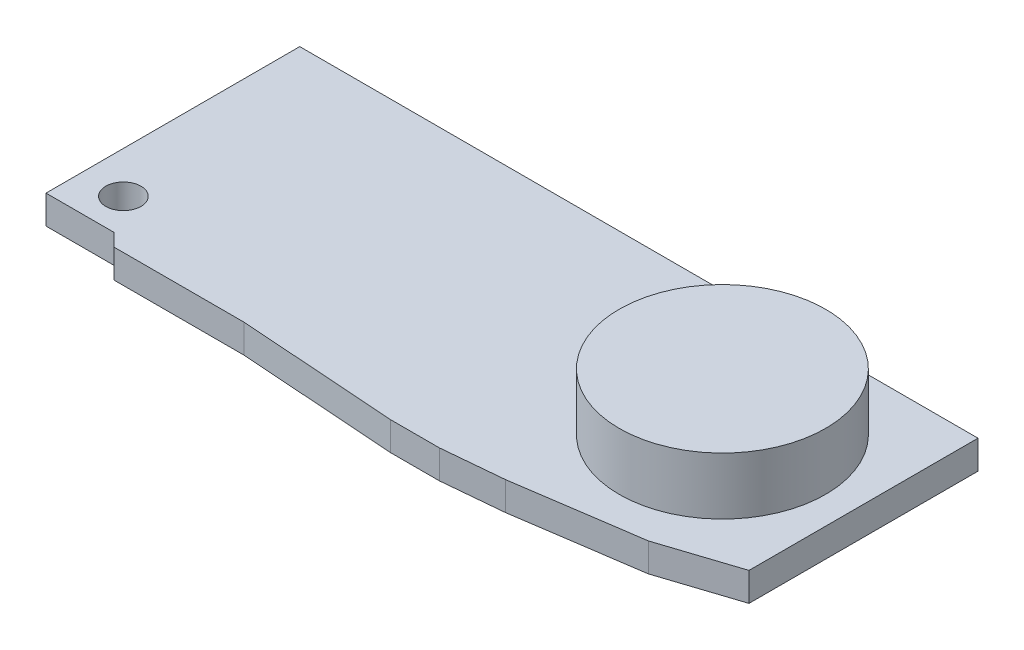
ISO-10303-21;
HEADER;
FILE_DESCRIPTION(('STEP AP214'),'2;1');
FILE_NAME('part.step','',(''),(''),'','','');
FILE_SCHEMA(('AUTOMOTIVE_DESIGN { 1 0 10303 214 1 1 1 1 }'));
ENDSEC;
DATA;
#1=APPLICATION_CONTEXT('core data for automotive mechanical design processes');
#2=APPLICATION_PROTOCOL_DEFINITION('international standard','automotive_design',2000,#1);
#3=PRODUCT_CONTEXT('',#1,'mechanical');
#4=PRODUCT('Part','Part','',(#3));
#5=PRODUCT_RELATED_PRODUCT_CATEGORY('part','',(#4));
#6=PRODUCT_DEFINITION_FORMATION('','',#4);
#7=PRODUCT_DEFINITION_CONTEXT('part definition',#1,'design');
#8=PRODUCT_DEFINITION('design','',#6,#7);
#9=PRODUCT_DEFINITION_SHAPE('','',#8);
#10=(LENGTH_UNIT() NAMED_UNIT(*) SI_UNIT(.MILLI.,.METRE.));
#11=(NAMED_UNIT(*) PLANE_ANGLE_UNIT() SI_UNIT($,.RADIAN.));
#12=(NAMED_UNIT(*) SI_UNIT($,.STERADIAN.) SOLID_ANGLE_UNIT());
#13=UNCERTAINTY_MEASURE_WITH_UNIT(LENGTH_MEASURE(1.E-05),#10,'distance_accuracy_value','');
#14=(GEOMETRIC_REPRESENTATION_CONTEXT(3) GLOBAL_UNCERTAINTY_ASSIGNED_CONTEXT((#13)) GLOBAL_UNIT_ASSIGNED_CONTEXT((#10,
#11,#12)) REPRESENTATION_CONTEXT('',''));
#15=CARTESIAN_POINT('',(0.,0.,0.));
#16=DIRECTION('',(0.,0.,1.));
#17=DIRECTION('',(1.,0.,0.));
#18=AXIS2_PLACEMENT_3D('',#15,#16,#17);
#19=CARTESIAN_POINT('',(0.,0.,0.));
#20=DIRECTION('',(0.,1.,0.));
#21=DIRECTION('',(0.,0.,1.));
#22=AXIS2_PLACEMENT_3D('',#19,#20,#21);
#23=PLANE('',#22);
#24=DIRECTION('',(0.,0.,-1.));
#25=VECTOR('',#24,1.);
#26=CARTESIAN_POINT('',(-10.4945123165591,0.,9.25714667301146));
#27=LINE('',#26,#25);
#28=CARTESIAN_POINT('',(-10.4945123165591,0.,9.25714667301146));
#29=VERTEX_POINT('',#28);
#30=CARTESIAN_POINT('',(-10.4945123165591,0.,6.21528739406918));
#31=VERTEX_POINT('',#30);
#32=EDGE_CURVE('E274',#29,#31,#27,.T.);
#33=ORIENTED_EDGE('',*,*,#32,.F.);
#34=DIRECTION('',(-1.,0.,0.));
#35=VECTOR('',#34,1.);
#36=CARTESIAN_POINT('',(-10.4945123165591,0.,9.25714667301146));
#37=LINE('',#36,#35);
#38=CARTESIAN_POINT('',(-8.60988211112745,0.,9.25714667301146));
#39=VERTEX_POINT('',#38);
#40=EDGE_CURVE('E264',#39,#29,#37,.T.);
#41=ORIENTED_EDGE('',*,*,#40,.F.);
#42=DIRECTION('',(0.,0.,1.));
#43=VECTOR('',#42,1.);
#44=CARTESIAN_POINT('',(-8.60988211112745,0.,9.25714667301146));
#45=LINE('',#44,#43);
#46=CARTESIAN_POINT('',(-8.60988211112745,0.,6.21528739406918));
#47=VERTEX_POINT('',#46);
#48=EDGE_CURVE('E267',#47,#39,#45,.T.);
#49=ORIENTED_EDGE('',*,*,#48,.F.);
#50=DIRECTION('',(1.,0.,0.));
#51=VECTOR('',#50,1.);
#52=CARTESIAN_POINT('',(-10.4945123165591,0.,6.21528739406918));
#53=LINE('',#52,#51);
#54=EDGE_CURVE('E271',#31,#47,#53,.T.);
#55=ORIENTED_EDGE('',*,*,#54,.F.);
#56=EDGE_LOOP('',(#33,#41,#49,#55));
#57=FACE_BOUND('',#56,.T.);
#58=DIRECTION('',(0.,0.,-1.));
#59=VECTOR('',#58,1.);
#60=CARTESIAN_POINT('',(9.74046462596995,0.,9.58778355115735));
#61=LINE('',#60,#59);
#62=CARTESIAN_POINT('',(9.74046462596995,0.,9.58778355115735));
#63=VERTEX_POINT('',#62);
#64=CARTESIAN_POINT('',(9.74046462596995,0.,6.57898796002967));
#65=VERTEX_POINT('',#64);
#66=EDGE_CURVE('E288',#63,#65,#61,.T.);
#67=ORIENTED_EDGE('',*,*,#66,.F.);
#68=DIRECTION('',(-1.,0.,0.));
#69=VECTOR('',#68,1.);
#70=CARTESIAN_POINT('',(9.74046462596995,0.,9.58778355115735));
#71=LINE('',#70,#69);
#72=CARTESIAN_POINT('',(12.319432275508,0.,9.58778355115735));
#73=VERTEX_POINT('',#72);
#74=EDGE_CURVE('E330',#73,#63,#71,.T.);
#75=ORIENTED_EDGE('',*,*,#74,.F.);
#76=DIRECTION('',(0.,0.,1.));
#77=VECTOR('',#76,1.);
#78=CARTESIAN_POINT('',(12.319432275508,0.,9.58778355115735));
#79=LINE('',#78,#77);
#80=CARTESIAN_POINT('',(12.319432275508,0.,6.57898796002967));
#81=VERTEX_POINT('',#80);
#82=EDGE_CURVE('E333',#81,#73,#79,.T.);
#83=ORIENTED_EDGE('',*,*,#82,.F.);
#84=DIRECTION('',(1.,0.,0.));
#85=VECTOR('',#84,1.);
#86=CARTESIAN_POINT('',(9.74046462596995,0.,6.57898796002967));
#87=LINE('',#86,#85);
#88=EDGE_CURVE('E337',#65,#81,#87,.T.);
#89=ORIENTED_EDGE('',*,*,#88,.F.);
#90=EDGE_LOOP('',(#67,#75,#83,#89));
#91=FACE_BOUND('',#90,.T.);
#92=DIRECTION('',(0.,0.,1.));
#93=VECTOR('',#92,1.);
#94=CARTESIAN_POINT('',(-27.4402840415828,0.,0.78422079076316));
#95=LINE('',#94,#93);
#96=CARTESIAN_POINT('',(-27.4402840415828,0.,0.78422079076316));
#97=VERTEX_POINT('',#96);
#98=CARTESIAN_POINT('',(-27.4402840415828,0.,18.5352260076823));
#99=VERTEX_POINT('',#98);
#100=EDGE_CURVE('E361',#97,#99,#95,.T.);
#101=ORIENTED_EDGE('',*,*,#100,.F.);
#102=DIRECTION('',(-1.,0.,0.));
#103=VECTOR('',#102,1.);
#104=CARTESIAN_POINT('',(-27.4402840415828,0.,0.78422079076316));
#105=LINE('',#104,#103);
#106=CARTESIAN_POINT('',(20.0073714124465,0.,0.78422079076316));
#107=VERTEX_POINT('',#106);
#108=EDGE_CURVE('E368',#107,#97,#105,.T.);
#109=ORIENTED_EDGE('',*,*,#108,.F.);
#110=DIRECTION('',(0.,0.,-1.));
#111=VECTOR('',#110,1.);
#112=CARTESIAN_POINT('',(20.0073714124465,0.,0.78422079076316));
#113=LINE('',#112,#111);
#114=CARTESIAN_POINT('',(20.0073714124465,0.,16.8047821028883));
#115=VERTEX_POINT('',#114);
#116=EDGE_CURVE('E407',#115,#107,#113,.T.);
#117=ORIENTED_EDGE('',*,*,#116,.F.);
#118=DIRECTION('',(0.950665699065624,0.,-0.310217228116151));
#119=VECTOR('',#118,1.);
#120=CARTESIAN_POINT('',(14.7043981558197,0.,18.5352260076823));
#121=LINE('',#120,#119);
#122=CARTESIAN_POINT('',(14.7043981558197,0.,18.5352260076823));
#123=VERTEX_POINT('',#122);
#124=EDGE_CURVE('E405',#123,#115,#121,.T.);
#125=ORIENTED_EDGE('',*,*,#124,.F.);
#126=DIRECTION('',(0.989305370259543,0.,-0.145859125102368));
#127=VECTOR('',#126,1.);
#128=CARTESIAN_POINT('',(5.99635786072725,0.,19.8191037434972));
#129=LINE('',#128,#127);
#130=CARTESIAN_POINT('',(5.99635786072725,0.,19.8191037434972));
#131=VERTEX_POINT('',#130);
#132=EDGE_CURVE('E403',#131,#123,#129,.T.);
#133=ORIENTED_EDGE('',*,*,#132,.F.);
#134=DIRECTION('',(0.995785108762236,0.,-0.09171704949126));
#135=VECTOR('',#134,1.);
#136=CARTESIAN_POINT('',(1.75397925542581,0.,20.209849141354));
#137=LINE('',#136,#135);
#138=CARTESIAN_POINT('',(1.75397925542581,0.,20.209849141354));
#139=VERTEX_POINT('',#138);
#140=EDGE_CURVE('E401',#139,#131,#137,.T.);
#141=ORIENTED_EDGE('',*,*,#140,.F.);
#142=DIRECTION('',(1.,0.,0.));
#143=VECTOR('',#142,1.);
#144=CARTESIAN_POINT('',(-1.65108778303982,0.,20.209849141354));
#145=LINE('',#144,#143);
#146=CARTESIAN_POINT('',(-1.65108778303982,0.,20.209849141354));
#147=VERTEX_POINT('',#146);
#148=EDGE_CURVE('E399',#147,#139,#145,.T.);
#149=ORIENTED_EDGE('',*,*,#148,.F.);
#150=DIRECTION('',(0.997509589282559,0.,0.0705309810603841));
#151=VECTOR('',#150,1.);
#152=CARTESIAN_POINT('',(-12.7036004652725,0.,19.4283583456405));
#153=LINE('',#152,#151);
#154=CARTESIAN_POINT('',(-12.7036004652725,0.,19.4283583456405));
#155=VERTEX_POINT('',#154);
#156=EDGE_CURVE('E397',#155,#147,#153,.T.);
#157=ORIENTED_EDGE('',*,*,#156,.F.);
#158=DIRECTION('',(1.,0.,0.));
#159=VECTOR('',#158,1.);
#160=CARTESIAN_POINT('',(-21.8023861582216,0.,19.4283583456405));
#161=LINE('',#160,#159);
#162=CARTESIAN_POINT('',(-21.8023861582216,0.,19.4283583456405));
#163=VERTEX_POINT('',#162);
#164=EDGE_CURVE('E395',#163,#155,#161,.T.);
#165=ORIENTED_EDGE('',*,*,#164,.F.);
#166=DIRECTION('',(0.707106781186556,0.,0.707106781186539));
#167=VECTOR('',#166,1.);
#168=CARTESIAN_POINT('',(-22.6955184961798,0.,18.5352260076823));
#169=LINE('',#168,#167);
#170=CARTESIAN_POINT('',(-22.6955184961798,0.,18.5352260076823));
#171=VERTEX_POINT('',#170);
#172=EDGE_CURVE('E393',#171,#163,#169,.T.);
#173=ORIENTED_EDGE('',*,*,#172,.F.);
#174=DIRECTION('',(1.,0.,0.));
#175=VECTOR('',#174,1.);
#176=CARTESIAN_POINT('',(-27.4402840415828,0.,18.5352260076823));
#177=LINE('',#176,#175);
#178=EDGE_CURVE('E391',#99,#171,#177,.T.);
#179=ORIENTED_EDGE('',*,*,#178,.F.);
#180=EDGE_LOOP('',(#101,#109,#117,#125,#133,#141,#149,#157,#165,#173,#179));
#181=FACE_BOUND('',#180,.T.);
#182=CARTESIAN_POINT('',(-24.5376039432186,0.,16.0232913071749));
#183=DIRECTION('',(0.,1.,0.));
#184=DIRECTION('',(0.,0.,1.));
#185=AXIS2_PLACEMENT_3D('',#182,#183,#184);
#186=CIRCLE('',#185,1.22932496396132);
#187=CARTESIAN_POINT('',(-24.5376039432186,0.,17.2526162711362));
#188=VERTEX_POINT('',#187);
#189=EDGE_CURVE('E355',#188,#188,#186,.T.);
#190=ORIENTED_EDGE('',*,*,#189,.T.);
#191=EDGE_LOOP('',(#190));
#192=FACE_BOUND('',#191,.T.);
#193=CARTESIAN_POINT('',(3.09367776236311,0.,3.07287240678104));
#194=DIRECTION('',(0.,1.,0.));
#195=DIRECTION('',(0.,0.,1.));
#196=AXIS2_PLACEMENT_3D('',#193,#194,#195);
#197=CIRCLE('',#196,1.14942002732158);
#198=CARTESIAN_POINT('',(3.09367776236311,0.,4.22229243410262));
#199=VERTEX_POINT('',#198);
#200=EDGE_CURVE('E350',#199,#199,#197,.T.);
#201=ORIENTED_EDGE('',*,*,#200,.T.);
#202=EDGE_LOOP('',(#201));
#203=FACE_BOUND('',#202,.T.);
#204=DIRECTION('',(0.,0.,-1.));
#205=VECTOR('',#204,1.);
#206=CARTESIAN_POINT('',(-1.96408086039488,0.,9.58778355115735));
#207=LINE('',#206,#205);
#208=CARTESIAN_POINT('',(-1.96408086039488,0.,9.58778355115735));
#209=VERTEX_POINT('',#208);
#210=CARTESIAN_POINT('',(-1.96408086039488,0.,6.21528739406918));
#211=VERTEX_POINT('',#210);
#212=EDGE_CURVE('E254',#209,#211,#207,.T.);
#213=ORIENTED_EDGE('',*,*,#212,.F.);
#214=DIRECTION('',(-1.,0.,0.));
#215=VECTOR('',#214,1.);
#216=CARTESIAN_POINT('',(-1.96408086039488,0.,9.58778355115735));
#217=LINE('',#216,#215);
#218=CARTESIAN_POINT('',(0.,0.,9.58778355115735));
#219=VERTEX_POINT('',#218);
#220=EDGE_CURVE('E298',#219,#209,#217,.T.);
#221=ORIENTED_EDGE('',*,*,#220,.F.);
#222=DIRECTION('',(0.,0.,1.));
#223=VECTOR('',#222,1.);
#224=CARTESIAN_POINT('',(0.,0.,9.58778355115735));
#225=LINE('',#224,#223);
#226=CARTESIAN_POINT('',(0.,0.,6.21528739406918));
#227=VERTEX_POINT('',#226);
#228=EDGE_CURVE('E301',#227,#219,#225,.T.);
#229=ORIENTED_EDGE('',*,*,#228,.F.);
#230=DIRECTION('',(1.,0.,0.));
#231=VECTOR('',#230,1.);
#232=CARTESIAN_POINT('',(-1.96408086039488,0.,6.21528739406918));
#233=LINE('',#232,#231);
#234=EDGE_CURVE('E305',#211,#227,#233,.T.);
#235=ORIENTED_EDGE('',*,*,#234,.F.);
#236=EDGE_LOOP('',(#213,#221,#229,#235));
#237=FACE_BOUND('',#236,.T.);
#238=DIRECTION('',(0.,0.,-1.));
#239=VECTOR('',#238,1.);
#240=CARTESIAN_POINT('',(-25.6376813356413,0.,8.89344610705096));
#241=LINE('',#240,#239);
#242=CARTESIAN_POINT('',(-25.6376813356413,0.,8.89344610705096));
#243=VERTEX_POINT('',#242);
#244=CARTESIAN_POINT('',(-25.6376813356413,0.,5.75239576466492));
#245=VERTEX_POINT('',#244);
#246=EDGE_CURVE('E240',#243,#245,#241,.T.);
#247=ORIENTED_EDGE('',*,*,#246,.F.);
#248=DIRECTION('',(-1.,0.,0.));
#249=VECTOR('',#248,1.);
#250=CARTESIAN_POINT('',(-25.6376813356413,0.,8.89344610705096));
#251=LINE('',#250,#249);
#252=CARTESIAN_POINT('',(-22.9925863104741,0.,8.89344610705096));
#253=VERTEX_POINT('',#252);
#254=EDGE_CURVE('E237',#253,#243,#251,.T.);
#255=ORIENTED_EDGE('',*,*,#254,.F.);
#256=DIRECTION('',(0.,0.,1.));
#257=VECTOR('',#256,1.);
#258=CARTESIAN_POINT('',(-22.9925863104741,0.,8.89344610705096));
#259=LINE('',#258,#257);
#260=CARTESIAN_POINT('',(-22.9925863104741,0.,5.75239576466492));
#261=VERTEX_POINT('',#260);
#262=EDGE_CURVE('E61',#261,#253,#259,.T.);
#263=ORIENTED_EDGE('',*,*,#262,.F.);
#264=DIRECTION('',(1.,0.,0.));
#265=VECTOR('',#264,1.);
#266=CARTESIAN_POINT('',(-25.6376813356413,0.,5.75239576466492));
#267=LINE('',#266,#265);
#268=EDGE_CURVE('E56',#245,#261,#267,.T.);
#269=ORIENTED_EDGE('',*,*,#268,.F.);
#270=EDGE_LOOP('',(#247,#255,#263,#269));
#271=FACE_BOUND('',#270,.T.);
#272=ADVANCED_FACE('F41',(#57,#91,#181,#192,#203,#237,#271),#23,.F.);
#273=CARTESIAN_POINT('',(0.,2.,0.));
#274=DIRECTION('',(0.,1.,0.));
#275=DIRECTION('',(0.,0.,1.));
#276=AXIS2_PLACEMENT_3D('',#273,#274,#275);
#277=PLANE('',#276);
#278=CARTESIAN_POINT('',(10.864630011666,2.,9.52165617552815));
#279=DIRECTION('',(0.,1.,0.));
#280=DIRECTION('',(0.,0.,1.));
#281=AXIS2_PLACEMENT_3D('',#278,#279,#280);
#282=CIRCLE('',#281,7.22129411276909);
#283=CARTESIAN_POINT('',(10.864630011666,2.,16.7429502882972));
#284=VERTEX_POINT('',#283);
#285=EDGE_CURVE('E241',#284,#284,#282,.T.);
#286=ORIENTED_EDGE('',*,*,#285,.F.);
#287=EDGE_LOOP('',(#286));
#288=FACE_BOUND('',#287,.T.);
#289=CARTESIAN_POINT('',(-24.5376039432186,2.,16.0232913071749));
#290=DIRECTION('',(0.,1.,0.));
#291=DIRECTION('',(0.,0.,1.));
#292=AXIS2_PLACEMENT_3D('',#289,#290,#291);
#293=CIRCLE('',#292,1.22932496396132);
#294=CARTESIAN_POINT('',(-24.5376039432186,2.,17.2526162711362));
#295=VERTEX_POINT('',#294);
#296=EDGE_CURVE('E358',#295,#295,#293,.T.);
#297=ORIENTED_EDGE('',*,*,#296,.F.);
#298=EDGE_LOOP('',(#297));
#299=FACE_BOUND('',#298,.T.);
#300=DIRECTION('',(0.,0.,1.));
#301=VECTOR('',#300,1.);
#302=CARTESIAN_POINT('',(-27.4402840415828,2.,0.78422079076316));
#303=LINE('',#302,#301);
#304=CARTESIAN_POINT('',(-27.4402840415828,2.,0.78422079076316));
#305=VERTEX_POINT('',#304);
#306=CARTESIAN_POINT('',(-27.4402840415828,2.,18.5352260076823));
#307=VERTEX_POINT('',#306);
#308=EDGE_CURVE('E364',#305,#307,#303,.T.);
#309=ORIENTED_EDGE('',*,*,#308,.T.);
#310=DIRECTION('',(1.,0.,0.));
#311=VECTOR('',#310,1.);
#312=CARTESIAN_POINT('',(-27.4402840415828,2.,18.5352260076823));
#313=LINE('',#312,#311);
#314=CARTESIAN_POINT('',(-22.6955184961798,2.,18.5352260076823));
#315=VERTEX_POINT('',#314);
#316=EDGE_CURVE('E367',#307,#315,#313,.T.);
#317=ORIENTED_EDGE('',*,*,#316,.T.);
#318=DIRECTION('',(0.707106781186556,0.,0.707106781186539));
#319=VECTOR('',#318,1.);
#320=CARTESIAN_POINT('',(-22.6955184961798,2.,18.5352260076823));
#321=LINE('',#320,#319);
#322=CARTESIAN_POINT('',(-21.8023861582216,2.,19.4283583456405));
#323=VERTEX_POINT('',#322);
#324=EDGE_CURVE('E370',#315,#323,#321,.T.);
#325=ORIENTED_EDGE('',*,*,#324,.T.);
#326=DIRECTION('',(1.,0.,0.));
#327=VECTOR('',#326,1.);
#328=CARTESIAN_POINT('',(-21.8023861582216,2.,19.4283583456405));
#329=LINE('',#328,#327);
#330=CARTESIAN_POINT('',(-12.7036004652725,2.,19.4283583456405));
#331=VERTEX_POINT('',#330);
#332=EDGE_CURVE('E372',#323,#331,#329,.T.);
#333=ORIENTED_EDGE('',*,*,#332,.T.);
#334=DIRECTION('',(0.997509589282559,0.,0.0705309810603841));
#335=VECTOR('',#334,1.);
#336=CARTESIAN_POINT('',(-12.7036004652725,2.,19.4283583456405));
#337=LINE('',#336,#335);
#338=CARTESIAN_POINT('',(-1.65108778303982,2.,20.209849141354));
#339=VERTEX_POINT('',#338);
#340=EDGE_CURVE('E374',#331,#339,#337,.T.);
#341=ORIENTED_EDGE('',*,*,#340,.T.);
#342=DIRECTION('',(1.,0.,0.));
#343=VECTOR('',#342,1.);
#344=CARTESIAN_POINT('',(-1.65108778303982,2.,20.209849141354));
#345=LINE('',#344,#343);
#346=CARTESIAN_POINT('',(1.75397925542581,2.,20.209849141354));
#347=VERTEX_POINT('',#346);
#348=EDGE_CURVE('E376',#339,#347,#345,.T.);
#349=ORIENTED_EDGE('',*,*,#348,.T.);
#350=DIRECTION('',(0.995785108762236,0.,-0.09171704949126));
#351=VECTOR('',#350,1.);
#352=CARTESIAN_POINT('',(1.75397925542581,2.,20.209849141354));
#353=LINE('',#352,#351);
#354=CARTESIAN_POINT('',(5.99635786072725,2.,19.8191037434972));
#355=VERTEX_POINT('',#354);
#356=EDGE_CURVE('E378',#347,#355,#353,.T.);
#357=ORIENTED_EDGE('',*,*,#356,.T.);
#358=DIRECTION('',(0.989305370259543,0.,-0.145859125102368));
#359=VECTOR('',#358,1.);
#360=CARTESIAN_POINT('',(5.99635786072725,2.,19.8191037434972));
#361=LINE('',#360,#359);
#362=CARTESIAN_POINT('',(14.7043981558197,2.,18.5352260076823));
#363=VERTEX_POINT('',#362);
#364=EDGE_CURVE('E380',#355,#363,#361,.T.);
#365=ORIENTED_EDGE('',*,*,#364,.T.);
#366=DIRECTION('',(0.950665699065624,0.,-0.310217228116151));
#367=VECTOR('',#366,1.);
#368=CARTESIAN_POINT('',(14.7043981558197,2.,18.5352260076823));
#369=LINE('',#368,#367);
#370=CARTESIAN_POINT('',(20.0073714124465,2.,16.8047821028883));
#371=VERTEX_POINT('',#370);
#372=EDGE_CURVE('E382',#363,#371,#369,.T.);
#373=ORIENTED_EDGE('',*,*,#372,.T.);
#374=DIRECTION('',(0.,0.,-1.));
#375=VECTOR('',#374,1.);
#376=CARTESIAN_POINT('',(20.0073714124465,2.,0.78422079076316));
#377=LINE('',#376,#375);
#378=CARTESIAN_POINT('',(20.0073714124465,2.,0.78422079076316));
#379=VERTEX_POINT('',#378);
#380=EDGE_CURVE('E384',#371,#379,#377,.T.);
#381=ORIENTED_EDGE('',*,*,#380,.T.);
#382=DIRECTION('',(-1.,0.,0.));
#383=VECTOR('',#382,1.);
#384=CARTESIAN_POINT('',(-27.4402840415828,2.,0.78422079076316));
#385=LINE('',#384,#383);
#386=EDGE_CURVE('E386',#379,#305,#385,.T.);
#387=ORIENTED_EDGE('',*,*,#386,.T.);
#388=EDGE_LOOP('',(#309,#317,#325,#333,#341,#349,#357,#365,#373,#381,#387));
#389=FACE_BOUND('',#388,.T.);
#390=CARTESIAN_POINT('',(3.09367776236311,2.,3.07287240678104));
#391=DIRECTION('',(0.,1.,0.));
#392=DIRECTION('',(0.,0.,1.));
#393=AXIS2_PLACEMENT_3D('',#390,#391,#392);
#394=CIRCLE('',#393,1.14942002732158);
#395=CARTESIAN_POINT('',(3.09367776236311,2.,4.22229243410262));
#396=VERTEX_POINT('',#395);
#397=EDGE_CURVE('E352',#396,#396,#394,.T.);
#398=ORIENTED_EDGE('',*,*,#397,.F.);
#399=EDGE_LOOP('',(#398));
#400=FACE_BOUND('',#399,.T.);
#401=ADVANCED_FACE('F459',(#288,#299,#389,#400),#277,.T.);
#402=CARTESIAN_POINT('',(-27.4402840415828,2.,0.78422079076316));
#403=DIRECTION('',(1.,0.,0.));
#404=DIRECTION('',(0.,0.,-1.));
#405=AXIS2_PLACEMENT_3D('',#402,#403,#404);
#406=PLANE('',#405);
#407=ORIENTED_EDGE('',*,*,#100,.T.);
#408=DIRECTION('',(0.,-1.,0.));
#409=VECTOR('',#408,1.);
#410=CARTESIAN_POINT('',(-27.4402840415828,2.,18.5352260076823));
#411=LINE('',#410,#409);
#412=EDGE_CURVE('E11',#307,#99,#411,.T.);
#413=ORIENTED_EDGE('',*,*,#412,.F.);
#414=ORIENTED_EDGE('',*,*,#308,.F.);
#415=DIRECTION('',(0.,-1.,0.));
#416=VECTOR('',#415,1.);
#417=CARTESIAN_POINT('',(-27.4402840415828,2.,0.78422079076316));
#418=LINE('',#417,#416);
#419=EDGE_CURVE('E388',#305,#97,#418,.T.);
#420=ORIENTED_EDGE('',*,*,#419,.T.);
#421=EDGE_LOOP('',(#407,#413,#414,#420));
#422=FACE_BOUND('',#421,.T.);
#423=ADVANCED_FACE('F43',(#422),#406,.F.);
#424=CARTESIAN_POINT('',(-27.4402840415828,2.,18.5352260076823));
#425=DIRECTION('',(0.,0.,-1.));
#426=DIRECTION('',(-1.,0.,0.));
#427=AXIS2_PLACEMENT_3D('',#424,#425,#426);
#428=PLANE('',#427);
#429=ORIENTED_EDGE('',*,*,#178,.T.);
#430=DIRECTION('',(0.,-1.,0.));
#431=VECTOR('',#430,1.);
#432=CARTESIAN_POINT('',(-22.6955184961798,2.,18.5352260076823));
#433=LINE('',#432,#431);
#434=EDGE_CURVE('E49',#315,#171,#433,.T.);
#435=ORIENTED_EDGE('',*,*,#434,.F.);
#436=ORIENTED_EDGE('',*,*,#316,.F.);
#437=ORIENTED_EDGE('',*,*,#412,.T.);
#438=EDGE_LOOP('',(#429,#435,#436,#437));
#439=FACE_BOUND('',#438,.T.);
#440=ADVANCED_FACE('F464',(#439),#428,.F.);
#441=CARTESIAN_POINT('',(-22.6955184961798,2.,18.5352260076823));
#442=DIRECTION('',(0.707106781186539,0.,-0.707106781186556));
#443=DIRECTION('',(-0.707106781186556,0.,-0.707106781186539));
#444=AXIS2_PLACEMENT_3D('',#441,#442,#443);
#445=PLANE('',#444);
#446=ORIENTED_EDGE('',*,*,#172,.T.);
#447=DIRECTION('',(0.,-1.,0.));
#448=VECTOR('',#447,1.);
#449=CARTESIAN_POINT('',(-21.8023861582216,2.,19.4283583456405));
#450=LINE('',#449,#448);
#451=EDGE_CURVE('E433',#323,#163,#450,.T.);
#452=ORIENTED_EDGE('',*,*,#451,.F.);
#453=ORIENTED_EDGE('',*,*,#324,.F.);
#454=ORIENTED_EDGE('',*,*,#434,.T.);
#455=EDGE_LOOP('',(#446,#452,#453,#454));
#456=FACE_BOUND('',#455,.T.);
#457=ADVANCED_FACE('F440',(#456),#445,.F.);
#458=CARTESIAN_POINT('',(-21.8023861582216,2.,19.4283583456405));
#459=DIRECTION('',(0.,0.,-1.));
#460=DIRECTION('',(-1.,0.,0.));
#461=AXIS2_PLACEMENT_3D('',#458,#459,#460);
#462=PLANE('',#461);
#463=ORIENTED_EDGE('',*,*,#164,.T.);
#464=DIRECTION('',(0.,-1.,0.));
#465=VECTOR('',#464,1.);
#466=CARTESIAN_POINT('',(-12.7036004652725,2.,19.4283583456405));
#467=LINE('',#466,#465);
#468=EDGE_CURVE('E430',#331,#155,#467,.T.);
#469=ORIENTED_EDGE('',*,*,#468,.F.);
#470=ORIENTED_EDGE('',*,*,#332,.F.);
#471=ORIENTED_EDGE('',*,*,#451,.T.);
#472=EDGE_LOOP('',(#463,#469,#470,#471));
#473=FACE_BOUND('',#472,.T.);
#474=ADVANCED_FACE('F451',(#473),#462,.F.);
#475=CARTESIAN_POINT('',(-12.7036004652725,2.,19.4283583456405));
#476=DIRECTION('',(0.0705309810603841,0.,-0.997509589282559));
#477=DIRECTION('',(-0.997509589282559,0.,-0.0705309810603841));
#478=AXIS2_PLACEMENT_3D('',#475,#476,#477);
#479=PLANE('',#478);
#480=ORIENTED_EDGE('',*,*,#156,.T.);
#481=DIRECTION('',(0.,-1.,0.));
#482=VECTOR('',#481,1.);
#483=CARTESIAN_POINT('',(-1.65108778303982,2.,20.209849141354));
#484=LINE('',#483,#482);
#485=EDGE_CURVE('E427',#339,#147,#484,.T.);
#486=ORIENTED_EDGE('',*,*,#485,.F.);
#487=ORIENTED_EDGE('',*,*,#340,.F.);
#488=ORIENTED_EDGE('',*,*,#468,.T.);
#489=EDGE_LOOP('',(#480,#486,#487,#488));
#490=FACE_BOUND('',#489,.T.);
#491=ADVANCED_FACE('F455',(#490),#479,.F.);
#492=CARTESIAN_POINT('',(-1.65108778303982,2.,20.209849141354));
#493=DIRECTION('',(0.,0.,-1.));
#494=DIRECTION('',(-1.,0.,0.));
#495=AXIS2_PLACEMENT_3D('',#492,#493,#494);
#496=PLANE('',#495);
#497=ORIENTED_EDGE('',*,*,#148,.T.);
#498=DIRECTION('',(0.,-1.,0.));
#499=VECTOR('',#498,1.);
#500=CARTESIAN_POINT('',(1.75397925542581,2.,20.209849141354));
#501=LINE('',#500,#499);
#502=EDGE_CURVE('E424',#347,#139,#501,.T.);
#503=ORIENTED_EDGE('',*,*,#502,.F.);
#504=ORIENTED_EDGE('',*,*,#348,.F.);
#505=ORIENTED_EDGE('',*,*,#485,.T.);
#506=EDGE_LOOP('',(#497,#503,#504,#505));
#507=FACE_BOUND('',#506,.T.);
#508=ADVANCED_FACE('F492',(#507),#496,.F.);
#509=CARTESIAN_POINT('',(1.75397925542581,2.,20.209849141354));
#510=DIRECTION('',(-0.09171704949126,0.,-0.995785108762236));
#511=DIRECTION('',(-0.995785108762236,0.,0.09171704949126));
#512=AXIS2_PLACEMENT_3D('',#509,#510,#511);
#513=PLANE('',#512);
#514=ORIENTED_EDGE('',*,*,#140,.T.);
#515=DIRECTION('',(0.,-1.,0.));
#516=VECTOR('',#515,1.);
#517=CARTESIAN_POINT('',(5.99635786072725,2.,19.8191037434972));
#518=LINE('',#517,#516);
#519=EDGE_CURVE('E421',#355,#131,#518,.T.);
#520=ORIENTED_EDGE('',*,*,#519,.F.);
#521=ORIENTED_EDGE('',*,*,#356,.F.);
#522=ORIENTED_EDGE('',*,*,#502,.T.);
#523=EDGE_LOOP('',(#514,#520,#521,#522));
#524=FACE_BOUND('',#523,.T.);
#525=ADVANCED_FACE('F490',(#524),#513,.F.);
#526=CARTESIAN_POINT('',(5.99635786072725,2.,19.8191037434972));
#527=DIRECTION('',(-0.145859125102368,0.,-0.989305370259543));
#528=DIRECTION('',(-0.989305370259543,0.,0.145859125102368));
#529=AXIS2_PLACEMENT_3D('',#526,#527,#528);
#530=PLANE('',#529);
#531=ORIENTED_EDGE('',*,*,#132,.T.);
#532=DIRECTION('',(0.,-1.,0.));
#533=VECTOR('',#532,1.);
#534=CARTESIAN_POINT('',(14.7043981558197,2.,18.5352260076823));
#535=LINE('',#534,#533);
#536=EDGE_CURVE('E418',#363,#123,#535,.T.);
#537=ORIENTED_EDGE('',*,*,#536,.F.);
#538=ORIENTED_EDGE('',*,*,#364,.F.);
#539=ORIENTED_EDGE('',*,*,#519,.T.);
#540=EDGE_LOOP('',(#531,#537,#538,#539));
#541=FACE_BOUND('',#540,.T.);
#542=ADVANCED_FACE('F485',(#541),#530,.F.);
#543=CARTESIAN_POINT('',(14.7043981558197,2.,18.5352260076823));
#544=DIRECTION('',(-0.310217228116152,0.,-0.950665699065624));
#545=DIRECTION('',(-0.950665699065624,0.,0.310217228116152));
#546=AXIS2_PLACEMENT_3D('',#543,#544,#545);
#547=PLANE('',#546);
#548=ORIENTED_EDGE('',*,*,#124,.T.);
#549=DIRECTION('',(0.,-1.,0.));
#550=VECTOR('',#549,1.);
#551=CARTESIAN_POINT('',(20.0073714124465,2.,16.8047821028883));
#552=LINE('',#551,#550);
#553=EDGE_CURVE('E415',#371,#115,#552,.T.);
#554=ORIENTED_EDGE('',*,*,#553,.F.);
#555=ORIENTED_EDGE('',*,*,#372,.F.);
#556=ORIENTED_EDGE('',*,*,#536,.T.);
#557=EDGE_LOOP('',(#548,#554,#555,#556));
#558=FACE_BOUND('',#557,.T.);
#559=ADVANCED_FACE('F480',(#558),#547,.F.);
#560=CARTESIAN_POINT('',(20.0073714124465,2.,0.78422079076316));
#561=DIRECTION('',(-1.,0.,0.));
#562=DIRECTION('',(0.,0.,1.));
#563=AXIS2_PLACEMENT_3D('',#560,#561,#562);
#564=PLANE('',#563);
#565=ORIENTED_EDGE('',*,*,#116,.T.);
#566=DIRECTION('',(0.,-1.,0.));
#567=VECTOR('',#566,1.);
#568=CARTESIAN_POINT('',(20.0073714124465,2.,0.78422079076316));
#569=LINE('',#568,#567);
#570=EDGE_CURVE('E412',#379,#107,#569,.T.);
#571=ORIENTED_EDGE('',*,*,#570,.F.);
#572=ORIENTED_EDGE('',*,*,#380,.F.);
#573=ORIENTED_EDGE('',*,*,#553,.T.);
#574=EDGE_LOOP('',(#565,#571,#572,#573));
#575=FACE_BOUND('',#574,.T.);
#576=ADVANCED_FACE('F476',(#575),#564,.F.);
#577=CARTESIAN_POINT('',(-27.4402840415828,2.,0.78422079076316));
#578=DIRECTION('',(0.,0.,1.));
#579=DIRECTION('',(1.,0.,0.));
#580=AXIS2_PLACEMENT_3D('',#577,#578,#579);
#581=PLANE('',#580);
#582=ORIENTED_EDGE('',*,*,#108,.T.);
#583=ORIENTED_EDGE('',*,*,#419,.F.);
#584=ORIENTED_EDGE('',*,*,#386,.F.);
#585=ORIENTED_EDGE('',*,*,#570,.T.);
#586=EDGE_LOOP('',(#582,#583,#584,#585));
#587=FACE_BOUND('',#586,.T.);
#588=ADVANCED_FACE('F471',(#587),#581,.F.);
#589=CARTESIAN_POINT('',(-24.5376039432186,2.,16.0232913071749));
#590=DIRECTION('',(0.,-1.,0.));
#591=DIRECTION('',(0.,0.,-1.));
#592=AXIS2_PLACEMENT_3D('',#589,#590,#591);
#593=CYLINDRICAL_SURFACE('',#592,1.22932496396132);
#594=ORIENTED_EDGE('',*,*,#296,.T.);
#595=EDGE_LOOP('',(#594));
#596=FACE_BOUND('',#595,.T.);
#597=ORIENTED_EDGE('',*,*,#189,.F.);
#598=EDGE_LOOP('',(#597));
#599=FACE_BOUND('',#598,.T.);
#600=ADVANCED_FACE('F516',(#596,#599),#593,.F.);
#601=CARTESIAN_POINT('',(3.09367776236311,2.,3.07287240678104));
#602=DIRECTION('',(0.,-1.,0.));
#603=DIRECTION('',(0.,0.,-1.));
#604=AXIS2_PLACEMENT_3D('',#601,#602,#603);
#605=CYLINDRICAL_SURFACE('',#604,1.14942002732158);
#606=ORIENTED_EDGE('',*,*,#397,.T.);
#607=EDGE_LOOP('',(#606));
#608=FACE_BOUND('',#607,.T.);
#609=ORIENTED_EDGE('',*,*,#200,.F.);
#610=EDGE_LOOP('',(#609));
#611=FACE_BOUND('',#610,.T.);
#612=ADVANCED_FACE('F548',(#608,#611),#605,.F.);
#613=CARTESIAN_POINT('',(10.864630011666,6.,9.52165617552815));
#614=DIRECTION('',(0.,-1.,0.));
#615=DIRECTION('',(0.,0.,-1.));
#616=AXIS2_PLACEMENT_3D('',#613,#614,#615);
#617=CYLINDRICAL_SURFACE('',#616,7.22129411276909);
#618=CARTESIAN_POINT('',(10.864630011666,6.,9.52165617552815));
#619=DIRECTION('',(0.,1.,0.));
#620=DIRECTION('',(0.,0.,1.));
#621=AXIS2_PLACEMENT_3D('',#618,#619,#620);
#622=CIRCLE('',#621,7.22129411276909);
#623=CARTESIAN_POINT('',(10.864630011666,6.,16.7429502882972));
#624=VERTEX_POINT('',#623);
#625=EDGE_CURVE('E244',#624,#624,#622,.T.);
#626=ORIENTED_EDGE('',*,*,#625,.F.);
#627=EDGE_LOOP('',(#626));
#628=FACE_BOUND('',#627,.T.);
#629=ORIENTED_EDGE('',*,*,#285,.T.);
#630=EDGE_LOOP('',(#629));
#631=FACE_BOUND('',#630,.T.);
#632=ADVANCED_FACE('F555',(#628,#631),#617,.T.);
#633=CARTESIAN_POINT('',(10.864630011666,6.,9.52165617552815));
#634=DIRECTION('',(0.,1.,0.));
#635=DIRECTION('',(0.,0.,1.));
#636=AXIS2_PLACEMENT_3D('',#633,#634,#635);
#637=PLANE('',#636);
#638=ORIENTED_EDGE('',*,*,#625,.T.);
#639=EDGE_LOOP('',(#638));
#640=FACE_BOUND('',#639,.T.);
#641=ADVANCED_FACE('F570',(#640),#637,.T.);
#642=CARTESIAN_POINT('',(9.74046462596995,-2.5,9.58778355115735));
#643=DIRECTION('',(1.,0.,0.));
#644=DIRECTION('',(0.,0.,-1.));
#645=AXIS2_PLACEMENT_3D('',#642,#643,#644);
#646=PLANE('',#645);
#647=ORIENTED_EDGE('',*,*,#66,.T.);
#648=DIRECTION('',(0.,1.,0.));
#649=VECTOR('',#648,1.);
#650=CARTESIAN_POINT('',(9.74046462596995,-2.5,6.57898796002967));
#651=LINE('',#650,#649);
#652=CARTESIAN_POINT('',(9.74046462596995,-2.5,6.57898796002967));
#653=VERTEX_POINT('',#652);
#654=EDGE_CURVE('E317',#653,#65,#651,.T.);
#655=ORIENTED_EDGE('',*,*,#654,.F.);
#656=DIRECTION('',(0.,0.,-1.));
#657=VECTOR('',#656,1.);
#658=CARTESIAN_POINT('',(9.74046462596995,-2.5,9.58778355115735));
#659=LINE('',#658,#657);
#660=CARTESIAN_POINT('',(9.74046462596995,-2.5,9.58778355115735));
#661=VERTEX_POINT('',#660);
#662=EDGE_CURVE('E334',#661,#653,#659,.T.);
#663=ORIENTED_EDGE('',*,*,#662,.F.);
#664=DIRECTION('',(0.,1.,0.));
#665=VECTOR('',#664,1.);
#666=CARTESIAN_POINT('',(9.74046462596995,-2.5,9.58778355115735));
#667=LINE('',#666,#665);
#668=EDGE_CURVE('E326',#661,#63,#667,.T.);
#669=ORIENTED_EDGE('',*,*,#668,.T.);
#670=EDGE_LOOP('',(#647,#655,#663,#669));
#671=FACE_BOUND('',#670,.T.);
#672=ADVANCED_FACE('F578',(#671),#646,.F.);
#673=CARTESIAN_POINT('',(9.74046462596995,-2.5,6.57898796002967));
#674=DIRECTION('',(0.,0.,1.));
#675=DIRECTION('',(1.,0.,0.));
#676=AXIS2_PLACEMENT_3D('',#673,#674,#675);
#677=PLANE('',#676);
#678=ORIENTED_EDGE('',*,*,#88,.T.);
#679=DIRECTION('',(0.,1.,0.));
#680=VECTOR('',#679,1.);
#681=CARTESIAN_POINT('',(12.319432275508,-2.5,6.57898796002967));
#682=LINE('',#681,#680);
#683=CARTESIAN_POINT('',(12.319432275508,-2.5,6.57898796002967));
#684=VERTEX_POINT('',#683);
#685=EDGE_CURVE('E320',#684,#81,#682,.T.);
#686=ORIENTED_EDGE('',*,*,#685,.F.);
#687=DIRECTION('',(1.,0.,0.));
#688=VECTOR('',#687,1.);
#689=CARTESIAN_POINT('',(9.74046462596995,-2.5,6.57898796002967));
#690=LINE('',#689,#688);
#691=EDGE_CURVE('E345',#653,#684,#690,.T.);
#692=ORIENTED_EDGE('',*,*,#691,.F.);
#693=ORIENTED_EDGE('',*,*,#654,.T.);
#694=EDGE_LOOP('',(#678,#686,#692,#693));
#695=FACE_BOUND('',#694,.T.);
#696=ADVANCED_FACE('F594',(#695),#677,.F.);
#697=CARTESIAN_POINT('',(12.319432275508,-2.5,9.58778355115735));
#698=DIRECTION('',(-1.,0.,0.));
#699=DIRECTION('',(0.,0.,1.));
#700=AXIS2_PLACEMENT_3D('',#697,#698,#699);
#701=PLANE('',#700);
#702=ORIENTED_EDGE('',*,*,#82,.T.);
#703=DIRECTION('',(0.,1.,0.));
#704=VECTOR('',#703,1.);
#705=CARTESIAN_POINT('',(12.319432275508,-2.5,9.58778355115735));
#706=LINE('',#705,#704);
#707=CARTESIAN_POINT('',(12.319432275508,-2.5,9.58778355115735));
#708=VERTEX_POINT('',#707);
#709=EDGE_CURVE('E323',#708,#73,#706,.T.);
#710=ORIENTED_EDGE('',*,*,#709,.F.);
#711=DIRECTION('',(0.,0.,1.));
#712=VECTOR('',#711,1.);
#713=CARTESIAN_POINT('',(12.319432275508,-2.5,9.58778355115735));
#714=LINE('',#713,#712);
#715=EDGE_CURVE('E343',#684,#708,#714,.T.);
#716=ORIENTED_EDGE('',*,*,#715,.F.);
#717=ORIENTED_EDGE('',*,*,#685,.T.);
#718=EDGE_LOOP('',(#702,#710,#716,#717));
#719=FACE_BOUND('',#718,.T.);
#720=ADVANCED_FACE('F604',(#719),#701,.F.);
#721=CARTESIAN_POINT('',(9.74046462596995,-2.5,9.58778355115735));
#722=DIRECTION('',(0.,0.,-1.));
#723=DIRECTION('',(-1.,0.,0.));
#724=AXIS2_PLACEMENT_3D('',#721,#722,#723);
#725=PLANE('',#724);
#726=ORIENTED_EDGE('',*,*,#74,.T.);
#727=ORIENTED_EDGE('',*,*,#668,.F.);
#728=DIRECTION('',(-1.,0.,0.));
#729=VECTOR('',#728,1.);
#730=CARTESIAN_POINT('',(9.74046462596995,-2.5,9.58778355115735));
#731=LINE('',#730,#729);
#732=EDGE_CURVE('E329',#708,#661,#731,.T.);
#733=ORIENTED_EDGE('',*,*,#732,.F.);
#734=ORIENTED_EDGE('',*,*,#709,.T.);
#735=EDGE_LOOP('',(#726,#727,#733,#734));
#736=FACE_BOUND('',#735,.T.);
#737=ADVANCED_FACE('F614',(#736),#725,.F.);
#738=CARTESIAN_POINT('',(0.,-2.5,0.));
#739=DIRECTION('',(0.,-1.,0.));
#740=DIRECTION('',(0.,0.,-1.));
#741=AXIS2_PLACEMENT_3D('',#738,#739,#740);
#742=PLANE('',#741);
#743=ORIENTED_EDGE('',*,*,#662,.T.);
#744=ORIENTED_EDGE('',*,*,#691,.T.);
#745=ORIENTED_EDGE('',*,*,#715,.T.);
#746=ORIENTED_EDGE('',*,*,#732,.T.);
#747=EDGE_LOOP('',(#743,#744,#745,#746));
#748=FACE_BOUND('',#747,.T.);
#749=ADVANCED_FACE('F624',(#748),#742,.T.);
#750=CARTESIAN_POINT('',(-1.96408086039488,-2.5,9.58778355115735));
#751=DIRECTION('',(1.,0.,0.));
#752=DIRECTION('',(0.,0.,-1.));
#753=AXIS2_PLACEMENT_3D('',#750,#751,#752);
#754=PLANE('',#753);
#755=ORIENTED_EDGE('',*,*,#212,.T.);
#756=DIRECTION('',(0.,1.,0.));
#757=VECTOR('',#756,1.);
#758=CARTESIAN_POINT('',(-1.96408086039488,-2.5,6.21528739406918));
#759=LINE('',#758,#757);
#760=CARTESIAN_POINT('',(-1.96408086039488,-2.5,6.21528739406918));
#761=VERTEX_POINT('',#760);
#762=EDGE_CURVE('E284',#761,#211,#759,.T.);
#763=ORIENTED_EDGE('',*,*,#762,.F.);
#764=DIRECTION('',(0.,0.,-1.));
#765=VECTOR('',#764,1.);
#766=CARTESIAN_POINT('',(-1.96408086039488,-2.5,9.58778355115735));
#767=LINE('',#766,#765);
#768=CARTESIAN_POINT('',(-1.96408086039488,-2.5,9.58778355115735));
#769=VERTEX_POINT('',#768);
#770=EDGE_CURVE('E302',#769,#761,#767,.T.);
#771=ORIENTED_EDGE('',*,*,#770,.F.);
#772=DIRECTION('',(0.,1.,0.));
#773=VECTOR('',#772,1.);
#774=CARTESIAN_POINT('',(-1.96408086039488,-2.5,9.58778355115735));
#775=LINE('',#774,#773);
#776=EDGE_CURVE('E294',#769,#209,#775,.T.);
#777=ORIENTED_EDGE('',*,*,#776,.T.);
#778=EDGE_LOOP('',(#755,#763,#771,#777));
#779=FACE_BOUND('',#778,.T.);
#780=ADVANCED_FACE('F634',(#779),#754,.F.);
#781=CARTESIAN_POINT('',(-1.96408086039488,-2.5,6.21528739406918));
#782=DIRECTION('',(0.,0.,1.));
#783=DIRECTION('',(1.,0.,0.));
#784=AXIS2_PLACEMENT_3D('',#781,#782,#783);
#785=PLANE('',#784);
#786=ORIENTED_EDGE('',*,*,#234,.T.);
#787=DIRECTION('',(0.,1.,0.));
#788=VECTOR('',#787,1.);
#789=CARTESIAN_POINT('',(0.,-2.5,6.21528739406918));
#790=LINE('',#789,#788);
#791=CARTESIAN_POINT('',(0.,-2.5,6.21528739406918));
#792=VERTEX_POINT('',#791);
#793=EDGE_CURVE('E287',#792,#227,#790,.T.);
#794=ORIENTED_EDGE('',*,*,#793,.F.);
#795=DIRECTION('',(1.,0.,0.));
#796=VECTOR('',#795,1.);
#797=CARTESIAN_POINT('',(-1.96408086039488,-2.5,6.21528739406918));
#798=LINE('',#797,#796);
#799=EDGE_CURVE('E313',#761,#792,#798,.T.);
#800=ORIENTED_EDGE('',*,*,#799,.F.);
#801=ORIENTED_EDGE('',*,*,#762,.T.);
#802=EDGE_LOOP('',(#786,#794,#800,#801));
#803=FACE_BOUND('',#802,.T.);
#804=ADVANCED_FACE('F644',(#803),#785,.F.);
#805=CARTESIAN_POINT('',(0.,-2.5,9.58778355115735));
#806=DIRECTION('',(-1.,0.,0.));
#807=DIRECTION('',(0.,0.,1.));
#808=AXIS2_PLACEMENT_3D('',#805,#806,#807);
#809=PLANE('',#808);
#810=ORIENTED_EDGE('',*,*,#228,.T.);
#811=DIRECTION('',(0.,1.,0.));
#812=VECTOR('',#811,1.);
#813=CARTESIAN_POINT('',(0.,-2.5,9.58778355115735));
#814=LINE('',#813,#812);
#815=CARTESIAN_POINT('',(0.,-2.5,9.58778355115735));
#816=VERTEX_POINT('',#815);
#817=EDGE_CURVE('E291',#816,#219,#814,.T.);
#818=ORIENTED_EDGE('',*,*,#817,.F.);
#819=DIRECTION('',(0.,0.,1.));
#820=VECTOR('',#819,1.);
#821=CARTESIAN_POINT('',(0.,-2.5,9.58778355115735));
#822=LINE('',#821,#820);
#823=EDGE_CURVE('E311',#792,#816,#822,.T.);
#824=ORIENTED_EDGE('',*,*,#823,.F.);
#825=ORIENTED_EDGE('',*,*,#793,.T.);
#826=EDGE_LOOP('',(#810,#818,#824,#825));
#827=FACE_BOUND('',#826,.T.);
#828=ADVANCED_FACE('F654',(#827),#809,.F.);
#829=CARTESIAN_POINT('',(-1.96408086039488,-2.5,9.58778355115735));
#830=DIRECTION('',(0.,0.,-1.));
#831=DIRECTION('',(-1.,0.,0.));
#832=AXIS2_PLACEMENT_3D('',#829,#830,#831);
#833=PLANE('',#832);
#834=ORIENTED_EDGE('',*,*,#220,.T.);
#835=ORIENTED_EDGE('',*,*,#776,.F.);
#836=DIRECTION('',(-1.,0.,0.));
#837=VECTOR('',#836,1.);
#838=CARTESIAN_POINT('',(-1.96408086039488,-2.5,9.58778355115735));
#839=LINE('',#838,#837);
#840=EDGE_CURVE('E297',#816,#769,#839,.T.);
#841=ORIENTED_EDGE('',*,*,#840,.F.);
#842=ORIENTED_EDGE('',*,*,#817,.T.);
#843=EDGE_LOOP('',(#834,#835,#841,#842));
#844=FACE_BOUND('',#843,.T.);
#845=ADVANCED_FACE('F664',(#844),#833,.F.);
#846=CARTESIAN_POINT('',(0.,-2.5,0.));
#847=DIRECTION('',(0.,-1.,0.));
#848=DIRECTION('',(0.,0.,-1.));
#849=AXIS2_PLACEMENT_3D('',#846,#847,#848);
#850=PLANE('',#849);
#851=ORIENTED_EDGE('',*,*,#770,.T.);
#852=ORIENTED_EDGE('',*,*,#799,.T.);
#853=ORIENTED_EDGE('',*,*,#823,.T.);
#854=ORIENTED_EDGE('',*,*,#840,.T.);
#855=EDGE_LOOP('',(#851,#852,#853,#854));
#856=FACE_BOUND('',#855,.T.);
#857=ADVANCED_FACE('F674',(#856),#850,.T.);
#858=CARTESIAN_POINT('',(-10.4945123165591,-2.5,9.25714667301146));
#859=DIRECTION('',(1.,0.,0.));
#860=DIRECTION('',(0.,0.,-1.));
#861=AXIS2_PLACEMENT_3D('',#858,#859,#860);
#862=PLANE('',#861);
#863=ORIENTED_EDGE('',*,*,#32,.T.);
#864=DIRECTION('',(0.,1.,0.));
#865=VECTOR('',#864,1.);
#866=CARTESIAN_POINT('',(-10.4945123165591,-2.5,6.21528739406918));
#867=LINE('',#866,#865);
#868=CARTESIAN_POINT('',(-10.4945123165591,-2.5,6.21528739406918));
#869=VERTEX_POINT('',#868);
#870=EDGE_CURVE('E250',#869,#31,#867,.T.);
#871=ORIENTED_EDGE('',*,*,#870,.F.);
#872=DIRECTION('',(0.,0.,-1.));
#873=VECTOR('',#872,1.);
#874=CARTESIAN_POINT('',(-10.4945123165591,-2.5,9.25714667301146));
#875=LINE('',#874,#873);
#876=CARTESIAN_POINT('',(-10.4945123165591,-2.5,9.25714667301146));
#877=VERTEX_POINT('',#876);
#878=EDGE_CURVE('E268',#877,#869,#875,.T.);
#879=ORIENTED_EDGE('',*,*,#878,.F.);
#880=DIRECTION('',(0.,1.,0.));
#881=VECTOR('',#880,1.);
#882=CARTESIAN_POINT('',(-10.4945123165591,-2.5,9.25714667301146));
#883=LINE('',#882,#881);
#884=EDGE_CURVE('E260',#877,#29,#883,.T.);
#885=ORIENTED_EDGE('',*,*,#884,.T.);
#886=EDGE_LOOP('',(#863,#871,#879,#885));
#887=FACE_BOUND('',#886,.T.);
#888=ADVANCED_FACE('F684',(#887),#862,.F.);
#889=CARTESIAN_POINT('',(-10.4945123165591,-2.5,6.21528739406918));
#890=DIRECTION('',(0.,0.,1.));
#891=DIRECTION('',(1.,0.,0.));
#892=AXIS2_PLACEMENT_3D('',#889,#890,#891);
#893=PLANE('',#892);
#894=ORIENTED_EDGE('',*,*,#54,.T.);
#895=DIRECTION('',(0.,1.,0.));
#896=VECTOR('',#895,1.);
#897=CARTESIAN_POINT('',(-8.60988211112745,-2.5,6.21528739406918));
#898=LINE('',#897,#896);
#899=CARTESIAN_POINT('',(-8.60988211112745,-2.5,6.21528739406918));
#900=VERTEX_POINT('',#899);
#901=EDGE_CURVE('E253',#900,#47,#898,.T.);
#902=ORIENTED_EDGE('',*,*,#901,.F.);
#903=DIRECTION('',(1.,0.,0.));
#904=VECTOR('',#903,1.);
#905=CARTESIAN_POINT('',(-10.4945123165591,-2.5,6.21528739406918));
#906=LINE('',#905,#904);
#907=EDGE_CURVE('E280',#869,#900,#906,.T.);
#908=ORIENTED_EDGE('',*,*,#907,.F.);
#909=ORIENTED_EDGE('',*,*,#870,.T.);
#910=EDGE_LOOP('',(#894,#902,#908,#909));
#911=FACE_BOUND('',#910,.T.);
#912=ADVANCED_FACE('F694',(#911),#893,.F.);
#913=CARTESIAN_POINT('',(-8.60988211112745,-2.5,9.25714667301146));
#914=DIRECTION('',(-1.,0.,0.));
#915=DIRECTION('',(0.,0.,1.));
#916=AXIS2_PLACEMENT_3D('',#913,#914,#915);
#917=PLANE('',#916);
#918=ORIENTED_EDGE('',*,*,#48,.T.);
#919=DIRECTION('',(0.,1.,0.));
#920=VECTOR('',#919,1.);
#921=CARTESIAN_POINT('',(-8.60988211112745,-2.5,9.25714667301146));
#922=LINE('',#921,#920);
#923=CARTESIAN_POINT('',(-8.60988211112745,-2.5,9.25714667301146));
#924=VERTEX_POINT('',#923);
#925=EDGE_CURVE('E257',#924,#39,#922,.T.);
#926=ORIENTED_EDGE('',*,*,#925,.F.);
#927=DIRECTION('',(0.,0.,1.));
#928=VECTOR('',#927,1.);
#929=CARTESIAN_POINT('',(-8.60988211112745,-2.5,9.25714667301146));
#930=LINE('',#929,#928);
#931=EDGE_CURVE('E278',#900,#924,#930,.T.);
#932=ORIENTED_EDGE('',*,*,#931,.F.);
#933=ORIENTED_EDGE('',*,*,#901,.T.);
#934=EDGE_LOOP('',(#918,#926,#932,#933));
#935=FACE_BOUND('',#934,.T.);
#936=ADVANCED_FACE('F704',(#935),#917,.F.);
#937=CARTESIAN_POINT('',(-10.4945123165591,-2.5,9.25714667301146));
#938=DIRECTION('',(0.,0.,-1.));
#939=DIRECTION('',(-1.,0.,0.));
#940=AXIS2_PLACEMENT_3D('',#937,#938,#939);
#941=PLANE('',#940);
#942=ORIENTED_EDGE('',*,*,#40,.T.);
#943=ORIENTED_EDGE('',*,*,#884,.F.);
#944=DIRECTION('',(-1.,0.,0.));
#945=VECTOR('',#944,1.);
#946=CARTESIAN_POINT('',(-10.4945123165591,-2.5,9.25714667301146));
#947=LINE('',#946,#945);
#948=EDGE_CURVE('E263',#924,#877,#947,.T.);
#949=ORIENTED_EDGE('',*,*,#948,.F.);
#950=ORIENTED_EDGE('',*,*,#925,.T.);
#951=EDGE_LOOP('',(#942,#943,#949,#950));
#952=FACE_BOUND('',#951,.T.);
#953=ADVANCED_FACE('F714',(#952),#941,.F.);
#954=CARTESIAN_POINT('',(0.,-2.5,0.));
#955=DIRECTION('',(0.,-1.,0.));
#956=DIRECTION('',(0.,0.,-1.));
#957=AXIS2_PLACEMENT_3D('',#954,#955,#956);
#958=PLANE('',#957);
#959=ORIENTED_EDGE('',*,*,#878,.T.);
#960=ORIENTED_EDGE('',*,*,#907,.T.);
#961=ORIENTED_EDGE('',*,*,#931,.T.);
#962=ORIENTED_EDGE('',*,*,#948,.T.);
#963=EDGE_LOOP('',(#959,#960,#961,#962));
#964=FACE_BOUND('',#963,.T.);
#965=ADVANCED_FACE('F724',(#964),#958,.T.);
#966=CARTESIAN_POINT('',(-25.6376813356413,-2.5,8.89344610705096));
#967=DIRECTION('',(1.,0.,0.));
#968=DIRECTION('',(0.,0.,-1.));
#969=AXIS2_PLACEMENT_3D('',#966,#967,#968);
#970=PLANE('',#969);
#971=ORIENTED_EDGE('',*,*,#246,.T.);
#972=DIRECTION('',(0.,1.,0.));
#973=VECTOR('',#972,1.);
#974=CARTESIAN_POINT('',(-25.6376813356413,-2.5,5.75239576466492));
#975=LINE('',#974,#973);
#976=CARTESIAN_POINT('',(-25.6376813356413,-2.5,5.75239576466492));
#977=VERTEX_POINT('',#976);
#978=EDGE_CURVE('E221',#977,#245,#975,.T.);
#979=ORIENTED_EDGE('',*,*,#978,.F.);
#980=DIRECTION('',(0.,0.,-1.));
#981=VECTOR('',#980,1.);
#982=CARTESIAN_POINT('',(-25.6376813356413,-2.5,8.89344610705096));
#983=LINE('',#982,#981);
#984=CARTESIAN_POINT('',(-25.6376813356413,-2.5,8.89344610705096));
#985=VERTEX_POINT('',#984);
#986=EDGE_CURVE('E228',#985,#977,#983,.T.);
#987=ORIENTED_EDGE('',*,*,#986,.F.);
#988=DIRECTION('',(0.,1.,0.));
#989=VECTOR('',#988,1.);
#990=CARTESIAN_POINT('',(-25.6376813356413,-2.5,8.89344610705096));
#991=LINE('',#990,#989);
#992=EDGE_CURVE('E783',#985,#243,#991,.T.);
#993=ORIENTED_EDGE('',*,*,#992,.T.);
#994=EDGE_LOOP('',(#971,#979,#987,#993));
#995=FACE_BOUND('',#994,.T.);
#996=ADVANCED_FACE('F239',(#995),#970,.F.);
#997=CARTESIAN_POINT('',(-25.6376813356413,-2.5,5.75239576466492));
#998=DIRECTION('',(0.,0.,1.));
#999=DIRECTION('',(1.,0.,0.));
#1000=AXIS2_PLACEMENT_3D('',#997,#998,#999);
#1001=PLANE('',#1000);
#1002=ORIENTED_EDGE('',*,*,#268,.T.);
#1003=DIRECTION('',(0.,1.,0.));
#1004=VECTOR('',#1003,1.);
#1005=CARTESIAN_POINT('',(-22.9925863104741,-2.5,5.75239576466492));
#1006=LINE('',#1005,#1004);
#1007=CARTESIAN_POINT('',(-22.9925863104741,-2.5,5.75239576466492));
#1008=VERTEX_POINT('',#1007);
#1009=EDGE_CURVE('E224',#1008,#261,#1006,.T.);
#1010=ORIENTED_EDGE('',*,*,#1009,.F.);
#1011=DIRECTION('',(1.,0.,0.));
#1012=VECTOR('',#1011,1.);
#1013=CARTESIAN_POINT('',(-25.6376813356413,-2.5,5.75239576466492));
#1014=LINE('',#1013,#1012);
#1015=EDGE_CURVE('E217',#977,#1008,#1014,.T.);
#1016=ORIENTED_EDGE('',*,*,#1015,.F.);
#1017=ORIENTED_EDGE('',*,*,#978,.T.);
#1018=EDGE_LOOP('',(#1002,#1010,#1016,#1017));
#1019=FACE_BOUND('',#1018,.T.);
#1020=ADVANCED_FACE('F219',(#1019),#1001,.F.);
#1021=CARTESIAN_POINT('',(-22.9925863104741,-2.5,8.89344610705096));
#1022=DIRECTION('',(-1.,0.,0.));
#1023=DIRECTION('',(0.,0.,1.));
#1024=AXIS2_PLACEMENT_3D('',#1021,#1022,#1023);
#1025=PLANE('',#1024);
#1026=ORIENTED_EDGE('',*,*,#262,.T.);
#1027=DIRECTION('',(0.,1.,0.));
#1028=VECTOR('',#1027,1.);
#1029=CARTESIAN_POINT('',(-22.9925863104741,-2.5,8.89344610705096));
#1030=LINE('',#1029,#1028);
#1031=CARTESIAN_POINT('',(-22.9925863104741,-2.5,8.89344610705096));
#1032=VERTEX_POINT('',#1031);
#1033=EDGE_CURVE('E246',#1032,#253,#1030,.T.);
#1034=ORIENTED_EDGE('',*,*,#1033,.F.);
#1035=DIRECTION('',(0.,0.,1.));
#1036=VECTOR('',#1035,1.);
#1037=CARTESIAN_POINT('',(-22.9925863104741,-2.5,8.89344610705096));
#1038=LINE('',#1037,#1036);
#1039=EDGE_CURVE('E227',#1008,#1032,#1038,.T.);
#1040=ORIENTED_EDGE('',*,*,#1039,.F.);
#1041=ORIENTED_EDGE('',*,*,#1009,.T.);
#1042=EDGE_LOOP('',(#1026,#1034,#1040,#1041));
#1043=FACE_BOUND('',#1042,.T.);
#1044=ADVANCED_FACE('F751',(#1043),#1025,.F.);
#1045=CARTESIAN_POINT('',(-25.6376813356413,-2.5,8.89344610705096));
#1046=DIRECTION('',(0.,0.,-1.));
#1047=DIRECTION('',(-1.,0.,0.));
#1048=AXIS2_PLACEMENT_3D('',#1045,#1046,#1047);
#1049=PLANE('',#1048);
#1050=ORIENTED_EDGE('',*,*,#254,.T.);
#1051=ORIENTED_EDGE('',*,*,#992,.F.);
#1052=DIRECTION('',(-1.,0.,0.));
#1053=VECTOR('',#1052,1.);
#1054=CARTESIAN_POINT('',(-25.6376813356413,-2.5,8.89344610705096));
#1055=LINE('',#1054,#1053);
#1056=EDGE_CURVE('E233',#1032,#985,#1055,.T.);
#1057=ORIENTED_EDGE('',*,*,#1056,.F.);
#1058=ORIENTED_EDGE('',*,*,#1033,.T.);
#1059=EDGE_LOOP('',(#1050,#1051,#1057,#1058));
#1060=FACE_BOUND('',#1059,.T.);
#1061=ADVANCED_FACE('F760',(#1060),#1049,.F.);
#1062=CARTESIAN_POINT('',(0.,-2.5,0.));
#1063=DIRECTION('',(0.,-1.,0.));
#1064=DIRECTION('',(0.,0.,-1.));
#1065=AXIS2_PLACEMENT_3D('',#1062,#1063,#1064);
#1066=PLANE('',#1065);
#1067=ORIENTED_EDGE('',*,*,#986,.T.);
#1068=ORIENTED_EDGE('',*,*,#1015,.T.);
#1069=ORIENTED_EDGE('',*,*,#1039,.T.);
#1070=ORIENTED_EDGE('',*,*,#1056,.T.);
#1071=EDGE_LOOP('',(#1067,#1068,#1069,#1070));
#1072=FACE_BOUND('',#1071,.T.);
#1073=ADVANCED_FACE('F231',(#1072),#1066,.T.);
#1074=CLOSED_SHELL('',(#272,#401,#423,#440,#457,#474,#491,#508,#525,#542,#559,#576,#588,#600,
#612,#632,#641,#672,#696,#720,#737,#749,#780,#804,#828,#845,#857,#888,#912,#936,#953,#965,#996,
#1020,#1044,#1061,#1073));
#1075=MANIFOLD_SOLID_BREP('B2',#1074);
#1076=ADVANCED_BREP_SHAPE_REPRESENTATION('',(#18,#1075),#14);
#1077=SHAPE_DEFINITION_REPRESENTATION(#9,#1076);
ENDSEC;
END-ISO-10303-21;
